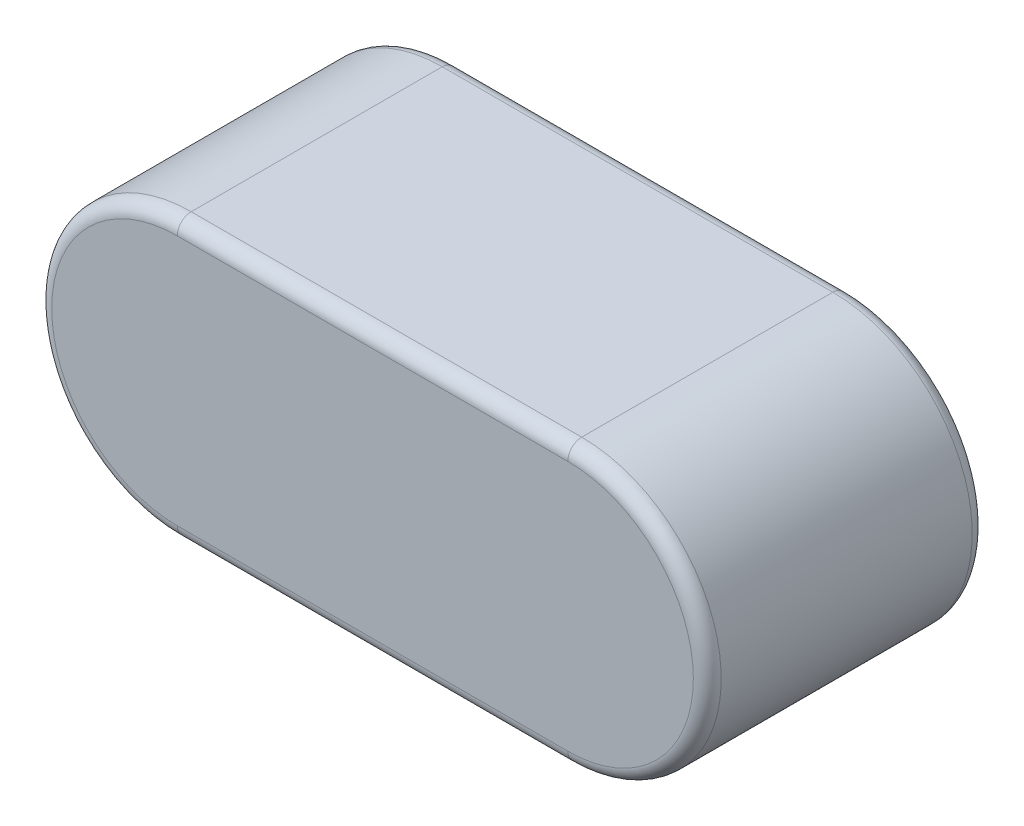
ISO-10303-21;
HEADER;
FILE_DESCRIPTION(('STEP AP214'),'2;1');
FILE_NAME('part.step','',(''),(''),'','','');
FILE_SCHEMA(('AUTOMOTIVE_DESIGN { 1 0 10303 214 1 1 1 1 }'));
ENDSEC;
DATA;
#1=APPLICATION_CONTEXT('core data for automotive mechanical design processes');
#2=APPLICATION_PROTOCOL_DEFINITION('international standard','automotive_design',2000,#1);
#3=PRODUCT_CONTEXT('',#1,'mechanical');
#4=PRODUCT('Part','Part','',(#3));
#5=PRODUCT_RELATED_PRODUCT_CATEGORY('part','',(#4));
#6=PRODUCT_DEFINITION_FORMATION('','',#4);
#7=PRODUCT_DEFINITION_CONTEXT('part definition',#1,'design');
#8=PRODUCT_DEFINITION('design','',#6,#7);
#9=PRODUCT_DEFINITION_SHAPE('','',#8);
#10=(LENGTH_UNIT() NAMED_UNIT(*) SI_UNIT(.MILLI.,.METRE.));
#11=(NAMED_UNIT(*) PLANE_ANGLE_UNIT() SI_UNIT($,.RADIAN.));
#12=(NAMED_UNIT(*) SI_UNIT($,.STERADIAN.) SOLID_ANGLE_UNIT());
#13=UNCERTAINTY_MEASURE_WITH_UNIT(LENGTH_MEASURE(1.E-05),#10,'distance_accuracy_value','');
#14=(GEOMETRIC_REPRESENTATION_CONTEXT(3) GLOBAL_UNCERTAINTY_ASSIGNED_CONTEXT((#13)) GLOBAL_UNIT_ASSIGNED_CONTEXT((#10,
#11,#12)) REPRESENTATION_CONTEXT('',''));
#15=CARTESIAN_POINT('',(0.,0.,0.));
#16=DIRECTION('',(0.,0.,1.));
#17=DIRECTION('',(1.,0.,0.));
#18=AXIS2_PLACEMENT_3D('',#15,#16,#17);
#19=CARTESIAN_POINT('',(0.,2.5,5.));
#20=DIRECTION('',(0.,0.,-1.));
#21=DIRECTION('',(-1.,0.,0.));
#22=AXIS2_PLACEMENT_3D('',#19,#20,#21);
#23=CYLINDRICAL_SURFACE('',#22,2.5);
#24=DIRECTION('',(0.,0.,-1.));
#25=VECTOR('',#24,1.);
#26=CARTESIAN_POINT('',(0.,5.,5.));
#27=LINE('',#26,#25);
#28=CARTESIAN_POINT('',(0.,5.,4.75));
#29=VERTEX_POINT('',#28);
#30=CARTESIAN_POINT('',(0.,5.,0.25));
#31=VERTEX_POINT('',#30);
#32=EDGE_CURVE('E731',#29,#31,#27,.T.);
#33=ORIENTED_EDGE('',*,*,#32,.T.);
#34=CARTESIAN_POINT('',(0.,2.5,0.25));
#35=DIRECTION('',(0.,0.,1.));
#36=DIRECTION('',(1.,0.,0.));
#37=AXIS2_PLACEMENT_3D('',#34,#35,#36);
#38=CIRCLE('',#37,2.5);
#39=CARTESIAN_POINT('',(0.,0.,0.25));
#40=VERTEX_POINT('',#39);
#41=EDGE_CURVE('E707',#31,#40,#38,.T.);
#42=ORIENTED_EDGE('',*,*,#41,.T.);
#43=DIRECTION('',(0.,0.,-1.));
#44=VECTOR('',#43,1.);
#45=CARTESIAN_POINT('',(0.,0.,5.));
#46=LINE('',#45,#44);
#47=CARTESIAN_POINT('',(0.,0.,4.75));
#48=VERTEX_POINT('',#47);
#49=EDGE_CURVE('E664',#48,#40,#46,.T.);
#50=ORIENTED_EDGE('',*,*,#49,.F.);
#51=CARTESIAN_POINT('',(0.,2.5,4.75));
#52=DIRECTION('',(0.,0.,1.));
#53=DIRECTION('',(1.,0.,0.));
#54=AXIS2_PLACEMENT_3D('',#51,#52,#53);
#55=CIRCLE('',#54,2.5);
#56=EDGE_CURVE('E703',#48,#29,#55,.F.);
#57=ORIENTED_EDGE('',*,*,#56,.T.);
#58=EDGE_LOOP('',(#33,#42,#50,#57));
#59=FACE_BOUND('',#58,.T.);
#60=ADVANCED_FACE('F574',(#59),#23,.T.);
#61=CARTESIAN_POINT('',(0.,0.,5.));
#62=DIRECTION('',(0.,1.,0.));
#63=DIRECTION('',(0.,0.,1.));
#64=AXIS2_PLACEMENT_3D('',#61,#62,#63);
#65=PLANE('',#64);
#66=ORIENTED_EDGE('',*,*,#49,.T.);
#67=DIRECTION('',(1.,0.,0.));
#68=VECTOR('',#67,1.);
#69=CARTESIAN_POINT('',(0.,0.,0.25));
#70=LINE('',#69,#68);
#71=CARTESIAN_POINT('',(7.,0.,0.25));
#72=VERTEX_POINT('',#71);
#73=EDGE_CURVE('E662',#40,#72,#70,.T.);
#74=ORIENTED_EDGE('',*,*,#73,.T.);
#75=DIRECTION('',(0.,0.,-1.));
#76=VECTOR('',#75,1.);
#77=CARTESIAN_POINT('',(7.,0.,5.));
#78=LINE('',#77,#76);
#79=CARTESIAN_POINT('',(7.,0.,4.75));
#80=VERTEX_POINT('',#79);
#81=EDGE_CURVE('E644',#80,#72,#78,.T.);
#82=ORIENTED_EDGE('',*,*,#81,.F.);
#83=DIRECTION('',(1.,0.,0.));
#84=VECTOR('',#83,1.);
#85=CARTESIAN_POINT('',(0.,0.,4.75));
#86=LINE('',#85,#84);
#87=EDGE_CURVE('E659',#80,#48,#86,.F.);
#88=ORIENTED_EDGE('',*,*,#87,.T.);
#89=EDGE_LOOP('',(#66,#74,#82,#88));
#90=FACE_BOUND('',#89,.T.);
#91=ADVANCED_FACE('F657',(#90),#65,.F.);
#92=CARTESIAN_POINT('',(7.,2.5,5.));
#93=DIRECTION('',(0.,0.,-1.));
#94=DIRECTION('',(-1.,0.,0.));
#95=AXIS2_PLACEMENT_3D('',#92,#93,#94);
#96=CYLINDRICAL_SURFACE('',#95,2.5);
#97=ORIENTED_EDGE('',*,*,#81,.T.);
#98=CARTESIAN_POINT('',(7.,2.5,0.25));
#99=DIRECTION('',(0.,0.,1.));
#100=DIRECTION('',(1.,0.,0.));
#101=AXIS2_PLACEMENT_3D('',#98,#99,#100);
#102=CIRCLE('',#101,2.5);
#103=CARTESIAN_POINT('',(7.,5.,0.25));
#104=VERTEX_POINT('',#103);
#105=EDGE_CURVE('E651',#72,#104,#102,.T.);
#106=ORIENTED_EDGE('',*,*,#105,.T.);
#107=DIRECTION('',(0.,0.,-1.));
#108=VECTOR('',#107,1.);
#109=CARTESIAN_POINT('',(7.,5.,5.));
#110=LINE('',#109,#108);
#111=CARTESIAN_POINT('',(7.,5.,4.75));
#112=VERTEX_POINT('',#111);
#113=EDGE_CURVE('E646',#112,#104,#110,.T.);
#114=ORIENTED_EDGE('',*,*,#113,.F.);
#115=CARTESIAN_POINT('',(7.,2.5,4.75));
#116=DIRECTION('',(0.,0.,1.));
#117=DIRECTION('',(1.,0.,0.));
#118=AXIS2_PLACEMENT_3D('',#115,#116,#117);
#119=CIRCLE('',#118,2.5);
#120=EDGE_CURVE('E641',#112,#80,#119,.F.);
#121=ORIENTED_EDGE('',*,*,#120,.T.);
#122=EDGE_LOOP('',(#97,#106,#114,#121));
#123=FACE_BOUND('',#122,.T.);
#124=ADVANCED_FACE('F643',(#123),#96,.T.);
#125=CARTESIAN_POINT('',(0.,5.,5.));
#126=DIRECTION('',(0.,1.,0.));
#127=DIRECTION('',(0.,0.,1.));
#128=AXIS2_PLACEMENT_3D('',#125,#126,#127);
#129=PLANE('',#128);
#130=ORIENTED_EDGE('',*,*,#113,.T.);
#131=DIRECTION('',(1.,0.,0.));
#132=VECTOR('',#131,1.);
#133=CARTESIAN_POINT('',(0.,5.,0.25));
#134=LINE('',#133,#132);
#135=EDGE_CURVE('E700',#104,#31,#134,.F.);
#136=ORIENTED_EDGE('',*,*,#135,.T.);
#137=ORIENTED_EDGE('',*,*,#32,.F.);
#138=DIRECTION('',(1.,0.,0.));
#139=VECTOR('',#138,1.);
#140=CARTESIAN_POINT('',(0.,5.,4.75));
#141=LINE('',#140,#139);
#142=EDGE_CURVE('E697',#29,#112,#141,.T.);
#143=ORIENTED_EDGE('',*,*,#142,.T.);
#144=EDGE_LOOP('',(#130,#136,#137,#143));
#145=FACE_BOUND('',#144,.T.);
#146=ADVANCED_FACE('F748',(#145),#129,.T.);
#147=CARTESIAN_POINT('',(0.,0.,5.));
#148=DIRECTION('',(0.,0.,1.));
#149=DIRECTION('',(1.,0.,0.));
#150=AXIS2_PLACEMENT_3D('',#147,#148,#149);
#151=PLANE('',#150);
#152=DIRECTION('',(1.,0.,0.));
#153=VECTOR('',#152,1.);
#154=CARTESIAN_POINT('',(0.,4.75,5.));
#155=LINE('',#154,#153);
#156=CARTESIAN_POINT('',(7.,4.75,5.));
#157=VERTEX_POINT('',#156);
#158=CARTESIAN_POINT('',(0.,4.75,5.));
#159=VERTEX_POINT('',#158);
#160=EDGE_CURVE('E584',#157,#159,#155,.F.);
#161=ORIENTED_EDGE('',*,*,#160,.T.);
#162=CARTESIAN_POINT('',(0.,2.5,5.));
#163=DIRECTION('',(0.,0.,1.));
#164=DIRECTION('',(1.,0.,0.));
#165=AXIS2_PLACEMENT_3D('',#162,#163,#164);
#166=CIRCLE('',#165,2.25);
#167=CARTESIAN_POINT('',(0.,0.25,5.));
#168=VERTEX_POINT('',#167);
#169=EDGE_CURVE('E14',#159,#168,#166,.T.);
#170=ORIENTED_EDGE('',*,*,#169,.T.);
#171=DIRECTION('',(1.,0.,0.));
#172=VECTOR('',#171,1.);
#173=CARTESIAN_POINT('',(7.,0.25,5.));
#174=LINE('',#173,#172);
#175=CARTESIAN_POINT('',(7.,0.25,5.));
#176=VERTEX_POINT('',#175);
#177=EDGE_CURVE('E710',#168,#176,#174,.T.);
#178=ORIENTED_EDGE('',*,*,#177,.T.);
#179=CARTESIAN_POINT('',(7.,2.5,5.));
#180=DIRECTION('',(0.,0.,1.));
#181=DIRECTION('',(1.,0.,0.));
#182=AXIS2_PLACEMENT_3D('',#179,#180,#181);
#183=CIRCLE('',#182,2.25);
#184=EDGE_CURVE('E595',#176,#157,#183,.T.);
#185=ORIENTED_EDGE('',*,*,#184,.T.);
#186=EDGE_LOOP('',(#161,#170,#178,#185));
#187=FACE_BOUND('',#186,.T.);
#188=ADVANCED_FACE('F847',(#187),#151,.T.);
#189=CARTESIAN_POINT('',(0.,0.,0.));
#190=DIRECTION('',(0.,0.,1.));
#191=DIRECTION('',(1.,0.,0.));
#192=AXIS2_PLACEMENT_3D('',#189,#190,#191);
#193=PLANE('',#192);
#194=CARTESIAN_POINT('',(7.,2.5,0.));
#195=DIRECTION('',(0.,0.,1.));
#196=DIRECTION('',(1.,0.,0.));
#197=AXIS2_PLACEMENT_3D('',#194,#195,#196);
#198=CIRCLE('',#197,2.25);
#199=CARTESIAN_POINT('',(7.,4.75,0.));
#200=VERTEX_POINT('',#199);
#201=CARTESIAN_POINT('',(7.,0.25,0.));
#202=VERTEX_POINT('',#201);
#203=EDGE_CURVE('E689',#200,#202,#198,.F.);
#204=ORIENTED_EDGE('',*,*,#203,.T.);
#205=DIRECTION('',(1.,0.,0.));
#206=VECTOR('',#205,1.);
#207=CARTESIAN_POINT('',(0.,0.25,0.));
#208=LINE('',#207,#206);
#209=CARTESIAN_POINT('',(0.,0.25,0.));
#210=VERTEX_POINT('',#209);
#211=EDGE_CURVE('E652',#202,#210,#208,.F.);
#212=ORIENTED_EDGE('',*,*,#211,.T.);
#213=CARTESIAN_POINT('',(0.,2.5,0.));
#214=DIRECTION('',(0.,0.,1.));
#215=DIRECTION('',(1.,0.,0.));
#216=AXIS2_PLACEMENT_3D('',#213,#214,#215);
#217=CIRCLE('',#216,2.25);
#218=CARTESIAN_POINT('',(0.,4.75,0.));
#219=VERTEX_POINT('',#218);
#220=EDGE_CURVE('E680',#210,#219,#217,.F.);
#221=ORIENTED_EDGE('',*,*,#220,.T.);
#222=DIRECTION('',(1.,0.,0.));
#223=VECTOR('',#222,1.);
#224=CARTESIAN_POINT('',(7.,4.75,0.));
#225=LINE('',#224,#223);
#226=EDGE_CURVE('E686',#219,#200,#225,.T.);
#227=ORIENTED_EDGE('',*,*,#226,.T.);
#228=EDGE_LOOP('',(#204,#212,#221,#227));
#229=FACE_BOUND('',#228,.T.);
#230=ADVANCED_FACE('F768',(#229),#193,.F.);
#231=CARTESIAN_POINT('',(0.,4.75,0.25));
#232=DIRECTION('',(-1.,0.,0.));
#233=DIRECTION('',(0.,0.,1.));
#234=AXIS2_PLACEMENT_3D('',#231,#232,#233);
#235=CYLINDRICAL_SURFACE('',#234,0.25);
#236=CARTESIAN_POINT('',(7.,4.75,0.25));
#237=DIRECTION('',(1.,0.,0.));
#238=DIRECTION('',(0.,0.,-1.));
#239=AXIS2_PLACEMENT_3D('',#236,#237,#238);
#240=CIRCLE('',#239,0.25);
#241=EDGE_CURVE('E723',#200,#104,#240,.T.);
#242=ORIENTED_EDGE('',*,*,#241,.F.);
#243=ORIENTED_EDGE('',*,*,#226,.F.);
#244=CARTESIAN_POINT('',(0.,4.75,0.25));
#245=DIRECTION('',(-1.,0.,0.));
#246=DIRECTION('',(0.,0.,1.));
#247=AXIS2_PLACEMENT_3D('',#244,#245,#246);
#248=CIRCLE('',#247,0.25);
#249=EDGE_CURVE('E727',#31,#219,#248,.T.);
#250=ORIENTED_EDGE('',*,*,#249,.F.);
#251=ORIENTED_EDGE('',*,*,#135,.F.);
#252=EDGE_LOOP('',(#242,#243,#250,#251));
#253=FACE_BOUND('',#252,.T.);
#254=ADVANCED_FACE('F758',(#253),#235,.T.);
#255=CARTESIAN_POINT('',(0.,2.5,0.25));
#256=DIRECTION('',(0.,0.,1.));
#257=DIRECTION('',(1.,0.,0.));
#258=AXIS2_PLACEMENT_3D('',#255,#256,#257);
#259=TOROIDAL_SURFACE('',#258,2.25,0.25);
#260=ORIENTED_EDGE('',*,*,#249,.T.);
#261=ORIENTED_EDGE('',*,*,#220,.F.);
#262=CARTESIAN_POINT('',(0.,0.25,0.25));
#263=DIRECTION('',(1.,0.,0.));
#264=DIRECTION('',(0.,0.,-1.));
#265=AXIS2_PLACEMENT_3D('',#262,#263,#264);
#266=CIRCLE('',#265,0.25);
#267=EDGE_CURVE('E720',#40,#210,#266,.T.);
#268=ORIENTED_EDGE('',*,*,#267,.F.);
#269=ORIENTED_EDGE('',*,*,#41,.F.);
#270=EDGE_LOOP('',(#260,#261,#268,#269));
#271=FACE_BOUND('',#270,.T.);
#272=ADVANCED_FACE('F774',(#271),#259,.T.);
#273=CARTESIAN_POINT('',(7.,2.5,0.25));
#274=DIRECTION('',(0.,0.,1.));
#275=DIRECTION('',(1.,0.,0.));
#276=AXIS2_PLACEMENT_3D('',#273,#274,#275);
#277=TOROIDAL_SURFACE('',#276,2.25,0.25);
#278=ORIENTED_EDGE('',*,*,#241,.T.);
#279=ORIENTED_EDGE('',*,*,#105,.F.);
#280=CARTESIAN_POINT('',(7.,0.25,0.25));
#281=DIRECTION('',(-1.,0.,0.));
#282=DIRECTION('',(0.,0.,1.));
#283=AXIS2_PLACEMENT_3D('',#280,#281,#282);
#284=CIRCLE('',#283,0.25);
#285=EDGE_CURVE('E717',#202,#72,#284,.T.);
#286=ORIENTED_EDGE('',*,*,#285,.F.);
#287=ORIENTED_EDGE('',*,*,#203,.F.);
#288=EDGE_LOOP('',(#278,#279,#286,#287));
#289=FACE_BOUND('',#288,.T.);
#290=ADVANCED_FACE('F764',(#289),#277,.T.);
#291=CARTESIAN_POINT('',(0.,0.25,0.25));
#292=DIRECTION('',(1.,0.,0.));
#293=DIRECTION('',(0.,0.,-1.));
#294=AXIS2_PLACEMENT_3D('',#291,#292,#293);
#295=CYLINDRICAL_SURFACE('',#294,0.25);
#296=ORIENTED_EDGE('',*,*,#267,.T.);
#297=ORIENTED_EDGE('',*,*,#211,.F.);
#298=ORIENTED_EDGE('',*,*,#285,.T.);
#299=ORIENTED_EDGE('',*,*,#73,.F.);
#300=EDGE_LOOP('',(#296,#297,#298,#299));
#301=FACE_BOUND('',#300,.T.);
#302=ADVANCED_FACE('F770',(#301),#295,.T.);
#303=CARTESIAN_POINT('',(7.,2.5,4.75));
#304=DIRECTION('',(0.,0.,1.));
#305=DIRECTION('',(1.,0.,0.));
#306=AXIS2_PLACEMENT_3D('',#303,#304,#305);
#307=TOROIDAL_SURFACE('',#306,2.25,0.25);
#308=CARTESIAN_POINT('',(7.,0.25,4.75));
#309=DIRECTION('',(-1.,0.,0.));
#310=DIRECTION('',(0.,0.,1.));
#311=AXIS2_PLACEMENT_3D('',#308,#309,#310);
#312=CIRCLE('',#311,0.25);
#313=EDGE_CURVE('E667',#80,#176,#312,.T.);
#314=ORIENTED_EDGE('',*,*,#313,.F.);
#315=ORIENTED_EDGE('',*,*,#120,.F.);
#316=CARTESIAN_POINT('',(7.,4.75,4.75));
#317=DIRECTION('',(-1.,0.,0.));
#318=DIRECTION('',(0.,0.,1.));
#319=AXIS2_PLACEMENT_3D('',#316,#317,#318);
#320=CIRCLE('',#319,0.25);
#321=EDGE_CURVE('E578',#157,#112,#320,.T.);
#322=ORIENTED_EDGE('',*,*,#321,.F.);
#323=ORIENTED_EDGE('',*,*,#184,.F.);
#324=EDGE_LOOP('',(#314,#315,#322,#323));
#325=FACE_BOUND('',#324,.T.);
#326=ADVANCED_FACE('F576',(#325),#307,.T.);
#327=CARTESIAN_POINT('',(0.,4.75,4.75));
#328=DIRECTION('',(1.,0.,0.));
#329=DIRECTION('',(0.,0.,-1.));
#330=AXIS2_PLACEMENT_3D('',#327,#328,#329);
#331=CYLINDRICAL_SURFACE('',#330,0.25);
#332=ORIENTED_EDGE('',*,*,#321,.T.);
#333=ORIENTED_EDGE('',*,*,#142,.F.);
#334=CARTESIAN_POINT('',(0.,4.75,4.75));
#335=DIRECTION('',(-1.,0.,0.));
#336=DIRECTION('',(0.,0.,1.));
#337=AXIS2_PLACEMENT_3D('',#334,#335,#336);
#338=CIRCLE('',#337,0.25);
#339=EDGE_CURVE('E671',#159,#29,#338,.T.);
#340=ORIENTED_EDGE('',*,*,#339,.F.);
#341=ORIENTED_EDGE('',*,*,#160,.F.);
#342=EDGE_LOOP('',(#332,#333,#340,#341));
#343=FACE_BOUND('',#342,.T.);
#344=ADVANCED_FACE('F742',(#343),#331,.T.);
#345=CARTESIAN_POINT('',(0.,0.25,4.75));
#346=DIRECTION('',(-1.,0.,0.));
#347=DIRECTION('',(0.,0.,1.));
#348=AXIS2_PLACEMENT_3D('',#345,#346,#347);
#349=CYLINDRICAL_SURFACE('',#348,0.25);
#350=ORIENTED_EDGE('',*,*,#313,.T.);
#351=ORIENTED_EDGE('',*,*,#177,.F.);
#352=CARTESIAN_POINT('',(0.,0.25,4.75));
#353=DIRECTION('',(-1.,0.,0.));
#354=DIRECTION('',(0.,0.,1.));
#355=AXIS2_PLACEMENT_3D('',#352,#353,#354);
#356=CIRCLE('',#355,0.25);
#357=EDGE_CURVE('E674',#48,#168,#356,.T.);
#358=ORIENTED_EDGE('',*,*,#357,.F.);
#359=ORIENTED_EDGE('',*,*,#87,.F.);
#360=EDGE_LOOP('',(#350,#351,#358,#359));
#361=FACE_BOUND('',#360,.T.);
#362=ADVANCED_FACE('F673',(#361),#349,.T.);
#363=CARTESIAN_POINT('',(0.,2.5,4.75));
#364=DIRECTION('',(0.,0.,1.));
#365=DIRECTION('',(1.,0.,0.));
#366=AXIS2_PLACEMENT_3D('',#363,#364,#365);
#367=TOROIDAL_SURFACE('',#366,2.25,0.25);
#368=ORIENTED_EDGE('',*,*,#339,.T.);
#369=ORIENTED_EDGE('',*,*,#56,.F.);
#370=ORIENTED_EDGE('',*,*,#357,.T.);
#371=ORIENTED_EDGE('',*,*,#169,.F.);
#372=EDGE_LOOP('',(#368,#369,#370,#371));
#373=FACE_BOUND('',#372,.T.);
#374=ADVANCED_FACE('F740',(#373),#367,.T.);
#375=CLOSED_SHELL('',(#60,#91,#124,#146,#188,#230,#254,#272,#290,#302,#326,#344,#362,#374));
#376=MANIFOLD_SOLID_BREP('B2',#375);
#377=ADVANCED_BREP_SHAPE_REPRESENTATION('',(#18,#376),#14);
#378=SHAPE_DEFINITION_REPRESENTATION(#9,#377);
ENDSEC;
END-ISO-10303-21;
